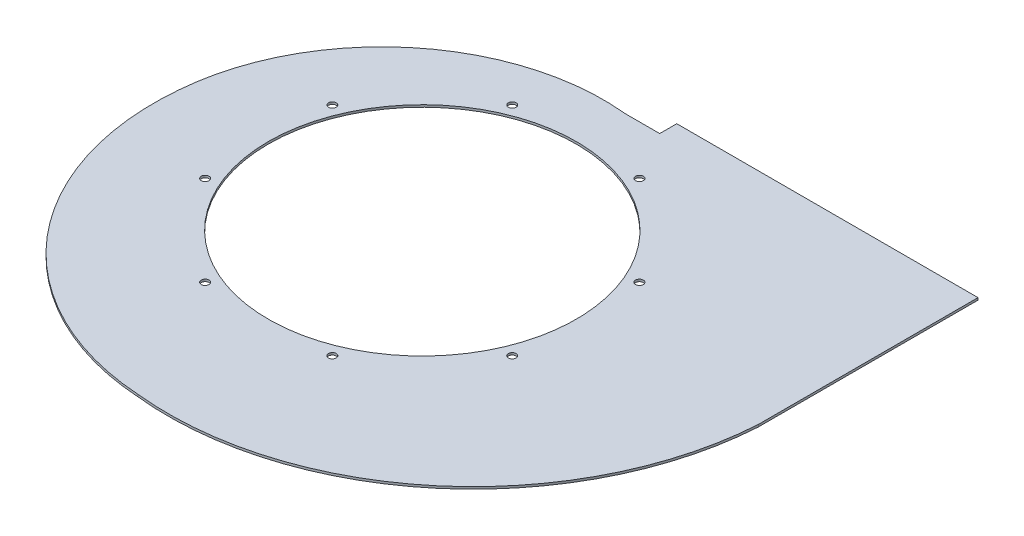
ISO-10303-21;
HEADER;
FILE_DESCRIPTION(('STEP AP214'),'2;1');
FILE_NAME('part.step','',(''),(''),'','','');
FILE_SCHEMA(('AUTOMOTIVE_DESIGN { 1 0 10303 214 1 1 1 1 }'));
ENDSEC;
DATA;
#1=APPLICATION_CONTEXT('core data for automotive mechanical design processes');
#2=APPLICATION_PROTOCOL_DEFINITION('international standard','automotive_design',2000,#1);
#3=PRODUCT_CONTEXT('',#1,'mechanical');
#4=PRODUCT('Part','Part','',(#3));
#5=PRODUCT_RELATED_PRODUCT_CATEGORY('part','',(#4));
#6=PRODUCT_DEFINITION_FORMATION('','',#4);
#7=PRODUCT_DEFINITION_CONTEXT('part definition',#1,'design');
#8=PRODUCT_DEFINITION('design','',#6,#7);
#9=PRODUCT_DEFINITION_SHAPE('','',#8);
#10=(LENGTH_UNIT() NAMED_UNIT(*) SI_UNIT(.MILLI.,.METRE.));
#11=(NAMED_UNIT(*) PLANE_ANGLE_UNIT() SI_UNIT($,.RADIAN.));
#12=(NAMED_UNIT(*) SI_UNIT($,.STERADIAN.) SOLID_ANGLE_UNIT());
#13=UNCERTAINTY_MEASURE_WITH_UNIT(LENGTH_MEASURE(1.E-05),#10,'distance_accuracy_value','');
#14=(GEOMETRIC_REPRESENTATION_CONTEXT(3) GLOBAL_UNCERTAINTY_ASSIGNED_CONTEXT((#13)) GLOBAL_UNIT_ASSIGNED_CONTEXT((#10,
#11,#12)) REPRESENTATION_CONTEXT('',''));
#15=CARTESIAN_POINT('',(0.,0.,0.));
#16=DIRECTION('',(0.,0.,1.));
#17=DIRECTION('',(1.,0.,0.));
#18=AXIS2_PLACEMENT_3D('',#15,#16,#17);
#19=CARTESIAN_POINT('',(199.99881862459,-142.996968900972,-295.996268284593));
#20=DIRECTION('',(0.,0.,-1.));
#21=DIRECTION('',(-1.,0.,0.));
#22=AXIS2_PLACEMENT_3D('',#19,#20,#21);
#23=PLANE('',#22);
#24=DIRECTION('',(-1.,0.,0.));
#25=VECTOR('',#24,1.);
#26=CARTESIAN_POINT('',(199.99881862459,-142.996968900972,-295.996268284593));
#27=LINE('',#26,#25);
#28=CARTESIAN_POINT('',(202.998818624593,-142.996968900972,-295.996268284593));
#29=VERTEX_POINT('',#28);
#30=CARTESIAN_POINT('',(-203.00118137541,-142.99696890097,-295.99626828459));
#31=VERTEX_POINT('',#30);
#32=EDGE_CURVE('E99',#29,#31,#27,.T.);
#33=ORIENTED_EDGE('',*,*,#32,.T.);
#34=DIRECTION('',(0.,-1.,0.));
#35=VECTOR('',#34,1.);
#36=CARTESIAN_POINT('',(-203.00118137541,-139.99696890097,-295.99626828459));
#37=LINE('',#36,#35);
#38=CARTESIAN_POINT('',(-203.00118137541,-139.99696890097,-295.99626828459));
#39=VERTEX_POINT('',#38);
#40=EDGE_CURVE('E158',#39,#31,#37,.T.);
#41=ORIENTED_EDGE('',*,*,#40,.F.);
#42=DIRECTION('',(-1.,0.,0.));
#43=VECTOR('',#42,1.);
#44=CARTESIAN_POINT('',(-166.225657767799,-139.99696890097,-295.996268284593));
#45=LINE('',#44,#43);
#46=CARTESIAN_POINT('',(202.998818624593,-139.996968900972,-295.996268284593));
#47=VERTEX_POINT('',#46);
#48=EDGE_CURVE('E67',#47,#39,#45,.T.);
#49=ORIENTED_EDGE('',*,*,#48,.F.);
#50=DIRECTION('',(0.,-1.,0.));
#51=VECTOR('',#50,1.);
#52=CARTESIAN_POINT('',(202.998818624593,-139.996968900972,-295.996268284593));
#53=LINE('',#52,#51);
#54=EDGE_CURVE('E141',#47,#29,#53,.T.);
#55=ORIENTED_EDGE('',*,*,#54,.T.);
#56=EDGE_LOOP('',(#33,#41,#49,#55));
#57=FACE_BOUND('',#56,.T.);
#58=ADVANCED_FACE('F48',(#57),#23,.T.);
#59=CARTESIAN_POINT('',(-250.001181375407,-142.996968900969,0.00373171541061601));
#60=DIRECTION('',(0.,1.,0.));
#61=DIRECTION('',(-1.,0.,0.));
#62=AXIS2_PLACEMENT_3D('',#59,#60,#61);
#63=CYLINDRICAL_SURFACE('',#62,207.5);
#64=CARTESIAN_POINT('',(-250.001181375407,-142.996968900969,0.00373171541061601));
#65=DIRECTION('',(0.,1.,0.));
#66=DIRECTION('',(-1.,0.,0.));
#67=AXIS2_PLACEMENT_3D('',#64,#65,#66);
#68=CIRCLE('',#67,207.5);
#69=CARTESIAN_POINT('',(-457.501181375407,-142.996968900968,0.00373171541061601));
#70=VERTEX_POINT('',#69);
#71=EDGE_CURVE('E168',#70,#70,#68,.T.);
#72=ORIENTED_EDGE('',*,*,#71,.F.);
#73=EDGE_LOOP('',(#72));
#74=FACE_BOUND('',#73,.T.);
#75=CARTESIAN_POINT('',(-250.001181375407,-139.996968900969,0.00373171541061344));
#76=DIRECTION('',(0.,1.,0.));
#77=DIRECTION('',(-1.,0.,0.));
#78=AXIS2_PLACEMENT_3D('',#75,#76,#77);
#79=CIRCLE('',#78,207.5);
#80=CARTESIAN_POINT('',(-457.501181375407,-139.996968900968,0.00373171541061344));
#81=VERTEX_POINT('',#80);
#82=EDGE_CURVE('E194',#81,#81,#79,.T.);
#83=ORIENTED_EDGE('',*,*,#82,.T.);
#84=EDGE_LOOP('',(#83));
#85=FACE_BOUND('',#84,.T.);
#86=ADVANCED_FACE('F236',(#74,#85),#63,.F.);
#87=CARTESIAN_POINT('',(-456.950196657907,-142.996968900968,85.7248205651921));
#88=DIRECTION('',(0.,1.,0.));
#89=DIRECTION('',(-1.,0.,0.));
#90=AXIS2_PLACEMENT_3D('',#87,#88,#89);
#91=CYLINDRICAL_SURFACE('',#90,5.25);
#92=CARTESIAN_POINT('',(-456.950196657907,-142.996968900968,85.7248205651921));
#93=DIRECTION('',(0.,1.,0.));
#94=DIRECTION('',(-1.,0.,0.));
#95=AXIS2_PLACEMENT_3D('',#92,#93,#94);
#96=CIRCLE('',#95,5.25);
#97=CARTESIAN_POINT('',(-462.200196657907,-142.996968900968,85.7248205651921));
#98=VERTEX_POINT('',#97);
#99=EDGE_CURVE('E173',#98,#98,#96,.T.);
#100=ORIENTED_EDGE('',*,*,#99,.F.);
#101=EDGE_LOOP('',(#100));
#102=FACE_BOUND('',#101,.T.);
#103=CARTESIAN_POINT('',(-456.950196657907,-139.996968900968,85.7248205651921));
#104=DIRECTION('',(0.,1.,0.));
#105=DIRECTION('',(-1.,0.,0.));
#106=AXIS2_PLACEMENT_3D('',#103,#104,#105);
#107=CIRCLE('',#106,5.25);
#108=CARTESIAN_POINT('',(-462.200196657907,-139.996968900968,85.7248205651921));
#109=VERTEX_POINT('',#108);
#110=EDGE_CURVE('E197',#109,#109,#107,.T.);
#111=ORIENTED_EDGE('',*,*,#110,.T.);
#112=EDGE_LOOP('',(#111));
#113=FACE_BOUND('',#112,.T.);
#114=ADVANCED_FACE('F240',(#102,#113),#91,.F.);
#115=CARTESIAN_POINT('',(-43.0521660929067,-142.99696890097,85.7248205651891));
#116=DIRECTION('',(0.,1.,0.));
#117=DIRECTION('',(-1.,0.,0.));
#118=AXIS2_PLACEMENT_3D('',#115,#116,#117);
#119=CYLINDRICAL_SURFACE('',#118,5.25);
#120=CARTESIAN_POINT('',(-43.0521660929067,-142.99696890097,85.7248205651891));
#121=DIRECTION('',(0.,1.,0.));
#122=DIRECTION('',(-1.,0.,0.));
#123=AXIS2_PLACEMENT_3D('',#120,#121,#122);
#124=CIRCLE('',#123,5.25);
#125=CARTESIAN_POINT('',(-48.3021660929067,-142.99696890097,85.7248205651891));
#126=VERTEX_POINT('',#125);
#127=EDGE_CURVE('E176',#126,#126,#124,.T.);
#128=ORIENTED_EDGE('',*,*,#127,.F.);
#129=EDGE_LOOP('',(#128));
#130=FACE_BOUND('',#129,.T.);
#131=CARTESIAN_POINT('',(-43.0521660929067,-139.99696890097,85.7248205651891));
#132=DIRECTION('',(0.,1.,0.));
#133=DIRECTION('',(-1.,0.,0.));
#134=AXIS2_PLACEMENT_3D('',#131,#132,#133);
#135=CIRCLE('',#134,5.25);
#136=CARTESIAN_POINT('',(-48.3021660929067,-139.99696890097,85.7248205651891));
#137=VERTEX_POINT('',#136);
#138=EDGE_CURVE('E200',#137,#137,#135,.T.);
#139=ORIENTED_EDGE('',*,*,#138,.T.);
#140=EDGE_LOOP('',(#139));
#141=FACE_BOUND('',#140,.T.);
#142=ADVANCED_FACE('F246',(#130,#141),#119,.F.);
#143=CARTESIAN_POINT('',(-43.052166092908,-142.996968900971,-85.7173571343709));
#144=DIRECTION('',(0.,1.,0.));
#145=DIRECTION('',(-1.,0.,0.));
#146=AXIS2_PLACEMENT_3D('',#143,#144,#145);
#147=CYLINDRICAL_SURFACE('',#146,5.25);
#148=CARTESIAN_POINT('',(-43.052166092908,-142.996968900971,-85.7173571343709));
#149=DIRECTION('',(0.,1.,0.));
#150=DIRECTION('',(-1.,0.,0.));
#151=AXIS2_PLACEMENT_3D('',#148,#149,#150);
#152=CIRCLE('',#151,5.25);
#153=CARTESIAN_POINT('',(-48.302166092908,-142.996968900971,-85.7173571343709));
#154=VERTEX_POINT('',#153);
#155=EDGE_CURVE('E179',#154,#154,#152,.T.);
#156=ORIENTED_EDGE('',*,*,#155,.F.);
#157=EDGE_LOOP('',(#156));
#158=FACE_BOUND('',#157,.T.);
#159=CARTESIAN_POINT('',(-43.052166092908,-139.996968900971,-85.7173571343709));
#160=DIRECTION('',(0.,1.,0.));
#161=DIRECTION('',(-1.,0.,0.));
#162=AXIS2_PLACEMENT_3D('',#159,#160,#161);
#163=CIRCLE('',#162,5.25);
#164=CARTESIAN_POINT('',(-48.302166092908,-139.996968900971,-85.7173571343709));
#165=VERTEX_POINT('',#164);
#166=EDGE_CURVE('E203',#165,#165,#163,.T.);
#167=ORIENTED_EDGE('',*,*,#166,.T.);
#168=EDGE_LOOP('',(#167));
#169=FACE_BOUND('',#168,.T.);
#170=ADVANCED_FACE('F250',(#158,#169),#147,.F.);
#171=CARTESIAN_POINT('',(-456.950196657908,-142.996968900968,-85.7173571343679));
#172=DIRECTION('',(0.,1.,0.));
#173=DIRECTION('',(-1.,0.,0.));
#174=AXIS2_PLACEMENT_3D('',#171,#172,#173);
#175=CYLINDRICAL_SURFACE('',#174,5.25);
#176=CARTESIAN_POINT('',(-456.950196657908,-142.996968900968,-85.7173571343679));
#177=DIRECTION('',(0.,1.,0.));
#178=DIRECTION('',(-1.,0.,0.));
#179=AXIS2_PLACEMENT_3D('',#176,#177,#178);
#180=CIRCLE('',#179,5.25);
#181=CARTESIAN_POINT('',(-462.200196657908,-142.996968900968,-85.7173571343679));
#182=VERTEX_POINT('',#181);
#183=EDGE_CURVE('E182',#182,#182,#180,.T.);
#184=ORIENTED_EDGE('',*,*,#183,.F.);
#185=EDGE_LOOP('',(#184));
#186=FACE_BOUND('',#185,.T.);
#187=CARTESIAN_POINT('',(-456.950196657908,-139.996968900968,-85.7173571343679));
#188=DIRECTION('',(0.,1.,0.));
#189=DIRECTION('',(-1.,0.,0.));
#190=AXIS2_PLACEMENT_3D('',#187,#188,#189);
#191=CIRCLE('',#190,5.25);
#192=CARTESIAN_POINT('',(-462.200196657908,-139.996968900968,-85.7173571343679));
#193=VERTEX_POINT('',#192);
#194=EDGE_CURVE('E206',#193,#193,#191,.T.);
#195=ORIENTED_EDGE('',*,*,#194,.T.);
#196=EDGE_LOOP('',(#195));
#197=FACE_BOUND('',#196,.T.);
#198=ADVANCED_FACE('F254',(#186,#197),#175,.F.);
#199=CARTESIAN_POINT('',(-335.722270225186,-142.996968900969,206.952746997911));
#200=DIRECTION('',(0.,1.,0.));
#201=DIRECTION('',(-1.,0.,0.));
#202=AXIS2_PLACEMENT_3D('',#199,#200,#201);
#203=CYLINDRICAL_SURFACE('',#202,5.24999999999999);
#204=CARTESIAN_POINT('',(-335.722270225186,-142.996968900969,206.952746997911));
#205=DIRECTION('',(0.,1.,0.));
#206=DIRECTION('',(-1.,0.,0.));
#207=AXIS2_PLACEMENT_3D('',#204,#205,#206);
#208=CIRCLE('',#207,5.24999999999999);
#209=CARTESIAN_POINT('',(-340.972270225186,-142.996968900969,206.952746997911));
#210=VERTEX_POINT('',#209);
#211=EDGE_CURVE('E185',#210,#210,#208,.T.);
#212=ORIENTED_EDGE('',*,*,#211,.F.);
#213=EDGE_LOOP('',(#212));
#214=FACE_BOUND('',#213,.T.);
#215=CARTESIAN_POINT('',(-335.722270225186,-139.996968900969,206.952746997911));
#216=DIRECTION('',(0.,1.,0.));
#217=DIRECTION('',(-1.,0.,0.));
#218=AXIS2_PLACEMENT_3D('',#215,#216,#217);
#219=CIRCLE('',#218,5.24999999999999);
#220=CARTESIAN_POINT('',(-340.972270225186,-139.996968900969,206.952746997911));
#221=VERTEX_POINT('',#220);
#222=EDGE_CURVE('E209',#221,#221,#219,.T.);
#223=ORIENTED_EDGE('',*,*,#222,.T.);
#224=EDGE_LOOP('',(#223));
#225=FACE_BOUND('',#224,.T.);
#226=ADVANCED_FACE('F258',(#214,#225),#203,.F.);
#227=CARTESIAN_POINT('',(-164.280092525626,-142.99696890097,206.95274699791));
#228=DIRECTION('',(0.,1.,0.));
#229=DIRECTION('',(-1.,0.,0.));
#230=AXIS2_PLACEMENT_3D('',#227,#228,#229);
#231=CYLINDRICAL_SURFACE('',#230,5.24999999999999);
#232=CARTESIAN_POINT('',(-164.280092525626,-142.99696890097,206.95274699791));
#233=DIRECTION('',(0.,1.,0.));
#234=DIRECTION('',(-1.,0.,0.));
#235=AXIS2_PLACEMENT_3D('',#232,#233,#234);
#236=CIRCLE('',#235,5.24999999999999);
#237=CARTESIAN_POINT('',(-169.530092525626,-142.99696890097,206.95274699791));
#238=VERTEX_POINT('',#237);
#239=EDGE_CURVE('E188',#238,#238,#236,.T.);
#240=ORIENTED_EDGE('',*,*,#239,.F.);
#241=EDGE_LOOP('',(#240));
#242=FACE_BOUND('',#241,.T.);
#243=CARTESIAN_POINT('',(-164.280092525626,-139.99696890097,206.95274699791));
#244=DIRECTION('',(0.,1.,0.));
#245=DIRECTION('',(-1.,0.,0.));
#246=AXIS2_PLACEMENT_3D('',#243,#244,#245);
#247=CIRCLE('',#246,5.24999999999999);
#248=CARTESIAN_POINT('',(-169.530092525626,-139.99696890097,206.95274699791));
#249=VERTEX_POINT('',#248);
#250=EDGE_CURVE('E212',#249,#249,#247,.T.);
#251=ORIENTED_EDGE('',*,*,#250,.T.);
#252=EDGE_LOOP('',(#251));
#253=FACE_BOUND('',#252,.T.);
#254=ADVANCED_FACE('F262',(#242,#253),#231,.F.);
#255=CARTESIAN_POINT('',(-164.280092525629,-142.99696890097,-206.94528356709));
#256=DIRECTION('',(0.,1.,0.));
#257=DIRECTION('',(-1.,0.,0.));
#258=AXIS2_PLACEMENT_3D('',#255,#256,#257);
#259=CYLINDRICAL_SURFACE('',#258,5.24999999999999);
#260=CARTESIAN_POINT('',(-164.280092525629,-142.99696890097,-206.94528356709));
#261=DIRECTION('',(0.,1.,0.));
#262=DIRECTION('',(-1.,0.,0.));
#263=AXIS2_PLACEMENT_3D('',#260,#261,#262);
#264=CIRCLE('',#263,5.24999999999999);
#265=CARTESIAN_POINT('',(-169.530092525629,-142.99696890097,-206.94528356709));
#266=VERTEX_POINT('',#265);
#267=EDGE_CURVE('E58',#266,#266,#264,.T.);
#268=ORIENTED_EDGE('',*,*,#267,.F.);
#269=EDGE_LOOP('',(#268));
#270=FACE_BOUND('',#269,.T.);
#271=CARTESIAN_POINT('',(-164.280092525629,-139.99696890097,-206.94528356709));
#272=DIRECTION('',(0.,1.,0.));
#273=DIRECTION('',(-1.,0.,0.));
#274=AXIS2_PLACEMENT_3D('',#271,#272,#273);
#275=CIRCLE('',#274,5.24999999999999);
#276=CARTESIAN_POINT('',(-169.530092525629,-139.99696890097,-206.94528356709));
#277=VERTEX_POINT('',#276);
#278=EDGE_CURVE('E214',#277,#277,#275,.T.);
#279=ORIENTED_EDGE('',*,*,#278,.T.);
#280=EDGE_LOOP('',(#279));
#281=FACE_BOUND('',#280,.T.);
#282=ADVANCED_FACE('F265',(#270,#281),#259,.F.);
#283=CARTESIAN_POINT('',(-335.722270225189,-142.996968900969,-206.945283567089));
#284=DIRECTION('',(0.,1.,0.));
#285=DIRECTION('',(-1.,0.,0.));
#286=AXIS2_PLACEMENT_3D('',#283,#284,#285);
#287=CYLINDRICAL_SURFACE('',#286,5.24999999999999);
#288=CARTESIAN_POINT('',(-335.722270225189,-142.996968900969,-206.945283567089));
#289=DIRECTION('',(0.,1.,0.));
#290=DIRECTION('',(-1.,0.,0.));
#291=AXIS2_PLACEMENT_3D('',#288,#289,#290);
#292=CIRCLE('',#291,5.24999999999999);
#293=CARTESIAN_POINT('',(-340.972270225189,-142.996968900969,-206.945283567089));
#294=VERTEX_POINT('',#293);
#295=EDGE_CURVE('E13',#294,#294,#292,.T.);
#296=ORIENTED_EDGE('',*,*,#295,.F.);
#297=EDGE_LOOP('',(#296));
#298=FACE_BOUND('',#297,.T.);
#299=CARTESIAN_POINT('',(-335.722270225189,-139.996968900969,-206.945283567089));
#300=DIRECTION('',(0.,1.,0.));
#301=DIRECTION('',(-1.,0.,0.));
#302=AXIS2_PLACEMENT_3D('',#299,#300,#301);
#303=CIRCLE('',#302,5.24999999999999);
#304=CARTESIAN_POINT('',(-340.972270225189,-139.996968900969,-206.945283567089));
#305=VERTEX_POINT('',#304);
#306=EDGE_CURVE('E52',#305,#305,#303,.T.);
#307=ORIENTED_EDGE('',*,*,#306,.T.);
#308=EDGE_LOOP('',(#307));
#309=FACE_BOUND('',#308,.T.);
#310=ADVANCED_FACE('F50',(#298,#309),#287,.F.);
#311=CARTESIAN_POINT('',(-166.225657767799,-142.99696890097,10.3857050223773));
#312=DIRECTION('',(0.,1.,0.));
#313=DIRECTION('',(-1.,0.,0.));
#314=AXIS2_PLACEMENT_3D('',#311,#312,#313);
#315=PLANE('',#314);
#316=ORIENTED_EDGE('',*,*,#32,.F.);
#317=DIRECTION('',(0.,0.,1.));
#318=VECTOR('',#317,1.);
#319=CARTESIAN_POINT('',(202.998818624593,-142.996968900972,0.0981735703448938));
#320=LINE('',#319,#318);
#321=CARTESIAN_POINT('',(202.998818624593,-142.996968900972,0.0981735703448938));
#322=VERTEX_POINT('',#321);
#323=EDGE_CURVE('E142',#29,#322,#320,.T.);
#324=ORIENTED_EDGE('',*,*,#323,.T.);
#325=CARTESIAN_POINT('',(-207.154194239235,-142.99696890097,-25.7037835180613));
#326=DIRECTION('',(0.,-1.,0.));
#327=DIRECTION('',(1.,0.,0.));
#328=AXIS2_PLACEMENT_3D('',#325,#326,#327);
#329=CIRCLE('',#328,410.963787882664);
#330=CARTESIAN_POINT('',(-250.253938148518,-142.996968900969,382.993717117582));
#331=VERTEX_POINT('',#330);
#332=EDGE_CURVE('E145',#322,#331,#329,.T.);
#333=ORIENTED_EDGE('',*,*,#332,.T.);
#334=CARTESIAN_POINT('',(-227.904024977349,-142.99696890097,32.1245847960234));
#335=DIRECTION('',(0.,-1.,0.));
#336=DIRECTION('',(1.,0.,0.));
#337=AXIS2_PLACEMENT_3D('',#334,#335,#336);
#338=CIRCLE('',#337,351.580242099641);
#339=CARTESIAN_POINT('',(-577.989841923088,-142.996968900968,-0.257314596645165));
#340=VERTEX_POINT('',#339);
#341=EDGE_CURVE('E148',#331,#340,#338,.T.);
#342=ORIENTED_EDGE('',*,*,#341,.T.);
#343=CARTESIAN_POINT('',(-280.229739567359,-142.996968900969,24.219356113987));
#344=DIRECTION('',(0.,-1.,0.));
#345=DIRECTION('',(1.,0.,0.));
#346=AXIS2_PLACEMENT_3D('',#343,#344,#345);
#347=CIRCLE('',#346,298.764432227082);
#348=CARTESIAN_POINT('',(-249.847860472498,-142.99696890097,-272.99626828459));
#349=VERTEX_POINT('',#348);
#350=EDGE_CURVE('E151',#340,#349,#347,.T.);
#351=ORIENTED_EDGE('',*,*,#350,.T.);
#352=DIRECTION('',(1.,0.,0.));
#353=VECTOR('',#352,1.);
#354=CARTESIAN_POINT('',(-203.00118137541,-142.99696890097,-272.99626828459));
#355=LINE('',#354,#353);
#356=CARTESIAN_POINT('',(-203.00118137541,-142.99696890097,-272.99626828459));
#357=VERTEX_POINT('',#356);
#358=EDGE_CURVE('E117',#349,#357,#355,.T.);
#359=ORIENTED_EDGE('',*,*,#358,.T.);
#360=DIRECTION('',(0.,0.,-1.));
#361=VECTOR('',#360,1.);
#362=CARTESIAN_POINT('',(-203.00118137541,-142.99696890097,-295.99626828459));
#363=LINE('',#362,#361);
#364=EDGE_CURVE('E154',#357,#31,#363,.T.);
#365=ORIENTED_EDGE('',*,*,#364,.T.);
#366=EDGE_LOOP('',(#316,#324,#333,#342,#351,#359,#365));
#367=FACE_BOUND('',#366,.T.);
#368=ORIENTED_EDGE('',*,*,#71,.T.);
#369=EDGE_LOOP('',(#368));
#370=FACE_BOUND('',#369,.T.);
#371=ORIENTED_EDGE('',*,*,#99,.T.);
#372=EDGE_LOOP('',(#371));
#373=FACE_BOUND('',#372,.T.);
#374=ORIENTED_EDGE('',*,*,#127,.T.);
#375=EDGE_LOOP('',(#374));
#376=FACE_BOUND('',#375,.T.);
#377=ORIENTED_EDGE('',*,*,#155,.T.);
#378=EDGE_LOOP('',(#377));
#379=FACE_BOUND('',#378,.T.);
#380=ORIENTED_EDGE('',*,*,#183,.T.);
#381=EDGE_LOOP('',(#380));
#382=FACE_BOUND('',#381,.T.);
#383=ORIENTED_EDGE('',*,*,#211,.T.);
#384=EDGE_LOOP('',(#383));
#385=FACE_BOUND('',#384,.T.);
#386=ORIENTED_EDGE('',*,*,#239,.T.);
#387=EDGE_LOOP('',(#386));
#388=FACE_BOUND('',#387,.T.);
#389=ORIENTED_EDGE('',*,*,#267,.T.);
#390=EDGE_LOOP('',(#389));
#391=FACE_BOUND('',#390,.T.);
#392=ORIENTED_EDGE('',*,*,#295,.T.);
#393=EDGE_LOOP('',(#392));
#394=FACE_BOUND('',#393,.T.);
#395=ADVANCED_FACE('F224',(#367,#370,#373,#376,#379,#382,#385,#388,#391,#394),#315,.F.);
#396=CARTESIAN_POINT('',(-166.225657767799,-139.99696890097,10.3857050223773));
#397=DIRECTION('',(0.,1.,0.));
#398=DIRECTION('',(-1.,0.,0.));
#399=AXIS2_PLACEMENT_3D('',#396,#397,#398);
#400=PLANE('',#399);
#401=DIRECTION('',(0.,0.,1.));
#402=VECTOR('',#401,1.);
#403=CARTESIAN_POINT('',(202.998818624593,-139.996968900972,0.0981735703448912));
#404=LINE('',#403,#402);
#405=CARTESIAN_POINT('',(202.998818624593,-139.996968900972,0.0981735703448912));
#406=VERTEX_POINT('',#405);
#407=EDGE_CURVE('E157',#47,#406,#404,.T.);
#408=ORIENTED_EDGE('',*,*,#407,.F.);
#409=ORIENTED_EDGE('',*,*,#48,.T.);
#410=DIRECTION('',(0.,0.,-1.));
#411=VECTOR('',#410,1.);
#412=CARTESIAN_POINT('',(-203.00118137541,-139.99696890097,-295.99626828459));
#413=LINE('',#412,#411);
#414=CARTESIAN_POINT('',(-203.00118137541,-139.99696890097,-272.99626828459));
#415=VERTEX_POINT('',#414);
#416=EDGE_CURVE('E131',#415,#39,#413,.T.);
#417=ORIENTED_EDGE('',*,*,#416,.F.);
#418=DIRECTION('',(1.,0.,0.));
#419=VECTOR('',#418,1.);
#420=CARTESIAN_POINT('',(-203.00118137541,-139.99696890097,-272.99626828459));
#421=LINE('',#420,#419);
#422=CARTESIAN_POINT('',(-249.847860472498,-139.99696890097,-272.99626828459));
#423=VERTEX_POINT('',#422);
#424=EDGE_CURVE('E116',#423,#415,#421,.T.);
#425=ORIENTED_EDGE('',*,*,#424,.F.);
#426=CARTESIAN_POINT('',(-280.229739567359,-139.996968900969,24.219356113987));
#427=DIRECTION('',(0.,-1.,0.));
#428=DIRECTION('',(1.,0.,0.));
#429=AXIS2_PLACEMENT_3D('',#426,#427,#428);
#430=CIRCLE('',#429,298.764432227082);
#431=CARTESIAN_POINT('',(-577.989841923088,-139.996968900968,-0.257314596645168));
#432=VERTEX_POINT('',#431);
#433=EDGE_CURVE('E128',#432,#423,#430,.T.);
#434=ORIENTED_EDGE('',*,*,#433,.F.);
#435=CARTESIAN_POINT('',(-227.904024977349,-139.99696890097,32.1245847960234));
#436=DIRECTION('',(0.,-1.,0.));
#437=DIRECTION('',(1.,0.,0.));
#438=AXIS2_PLACEMENT_3D('',#435,#436,#437);
#439=CIRCLE('',#438,351.580242099641);
#440=CARTESIAN_POINT('',(-250.253938148518,-139.996968900969,382.993717117582));
#441=VERTEX_POINT('',#440);
#442=EDGE_CURVE('E134',#441,#432,#439,.T.);
#443=ORIENTED_EDGE('',*,*,#442,.F.);
#444=CARTESIAN_POINT('',(-207.154194239235,-139.99696890097,-25.7037835180613));
#445=DIRECTION('',(0.,-1.,0.));
#446=DIRECTION('',(1.,0.,0.));
#447=AXIS2_PLACEMENT_3D('',#444,#445,#446);
#448=CIRCLE('',#447,410.963787882664);
#449=EDGE_CURVE('E136',#406,#441,#448,.T.);
#450=ORIENTED_EDGE('',*,*,#449,.F.);
#451=EDGE_LOOP('',(#408,#409,#417,#425,#434,#443,#450));
#452=FACE_BOUND('',#451,.T.);
#453=ORIENTED_EDGE('',*,*,#82,.F.);
#454=EDGE_LOOP('',(#453));
#455=FACE_BOUND('',#454,.T.);
#456=ORIENTED_EDGE('',*,*,#110,.F.);
#457=EDGE_LOOP('',(#456));
#458=FACE_BOUND('',#457,.T.);
#459=ORIENTED_EDGE('',*,*,#138,.F.);
#460=EDGE_LOOP('',(#459));
#461=FACE_BOUND('',#460,.T.);
#462=ORIENTED_EDGE('',*,*,#166,.F.);
#463=EDGE_LOOP('',(#462));
#464=FACE_BOUND('',#463,.T.);
#465=ORIENTED_EDGE('',*,*,#194,.F.);
#466=EDGE_LOOP('',(#465));
#467=FACE_BOUND('',#466,.T.);
#468=ORIENTED_EDGE('',*,*,#222,.F.);
#469=EDGE_LOOP('',(#468));
#470=FACE_BOUND('',#469,.T.);
#471=ORIENTED_EDGE('',*,*,#250,.F.);
#472=EDGE_LOOP('',(#471));
#473=FACE_BOUND('',#472,.T.);
#474=ORIENTED_EDGE('',*,*,#278,.F.);
#475=EDGE_LOOP('',(#474));
#476=FACE_BOUND('',#475,.T.);
#477=ORIENTED_EDGE('',*,*,#306,.F.);
#478=EDGE_LOOP('',(#477));
#479=FACE_BOUND('',#478,.T.);
#480=ADVANCED_FACE('F125',(#452,#455,#458,#461,#464,#467,#470,#473,#476,#479),#400,.T.);
#481=CARTESIAN_POINT('',(-203.00118137541,-139.99696890097,-295.99626828459));
#482=DIRECTION('',(-1.,0.,0.));
#483=DIRECTION('',(0.,-1.,0.));
#484=AXIS2_PLACEMENT_3D('',#481,#482,#483);
#485=PLANE('',#484);
#486=ORIENTED_EDGE('',*,*,#364,.F.);
#487=DIRECTION('',(0.,-1.,0.));
#488=VECTOR('',#487,1.);
#489=CARTESIAN_POINT('',(-203.00118137541,-139.99696890097,-272.99626828459));
#490=LINE('',#489,#488);
#491=EDGE_CURVE('E93',#415,#357,#490,.T.);
#492=ORIENTED_EDGE('',*,*,#491,.F.);
#493=ORIENTED_EDGE('',*,*,#416,.T.);
#494=ORIENTED_EDGE('',*,*,#40,.T.);
#495=EDGE_LOOP('',(#486,#492,#493,#494));
#496=FACE_BOUND('',#495,.T.);
#497=ADVANCED_FACE('F223',(#496),#485,.T.);
#498=CARTESIAN_POINT('',(-203.00118137541,-139.99696890097,-272.99626828459));
#499=DIRECTION('',(0.,0.,-1.));
#500=DIRECTION('',(0.,1.,0.));
#501=AXIS2_PLACEMENT_3D('',#498,#499,#500);
#502=PLANE('',#501);
#503=ORIENTED_EDGE('',*,*,#358,.F.);
#504=DIRECTION('',(0.,-1.,0.));
#505=VECTOR('',#504,1.);
#506=CARTESIAN_POINT('',(-249.847860472498,-139.99696890097,-272.99626828459));
#507=LINE('',#506,#505);
#508=EDGE_CURVE('E113',#423,#349,#507,.T.);
#509=ORIENTED_EDGE('',*,*,#508,.F.);
#510=ORIENTED_EDGE('',*,*,#424,.T.);
#511=ORIENTED_EDGE('',*,*,#491,.T.);
#512=EDGE_LOOP('',(#503,#509,#510,#511));
#513=FACE_BOUND('',#512,.T.);
#514=ADVANCED_FACE('F115',(#513),#502,.T.);
#515=CARTESIAN_POINT('',(-280.229739567359,-139.996968900969,24.219356113987));
#516=DIRECTION('',(0.,-1.,0.));
#517=DIRECTION('',(1.,0.,0.));
#518=AXIS2_PLACEMENT_3D('',#515,#516,#517);
#519=CYLINDRICAL_SURFACE('',#518,298.764432227082);
#520=ORIENTED_EDGE('',*,*,#350,.F.);
#521=DIRECTION('',(0.,-1.,0.));
#522=VECTOR('',#521,1.);
#523=CARTESIAN_POINT('',(-577.989841923088,-139.996968900968,-0.257314596645168));
#524=LINE('',#523,#522);
#525=EDGE_CURVE('E122',#432,#340,#524,.T.);
#526=ORIENTED_EDGE('',*,*,#525,.F.);
#527=ORIENTED_EDGE('',*,*,#433,.T.);
#528=ORIENTED_EDGE('',*,*,#508,.T.);
#529=EDGE_LOOP('',(#520,#526,#527,#528));
#530=FACE_BOUND('',#529,.T.);
#531=ADVANCED_FACE('F133',(#530),#519,.T.);
#532=CARTESIAN_POINT('',(-227.904024977349,-139.99696890097,32.1245847960234));
#533=DIRECTION('',(0.,-1.,0.));
#534=DIRECTION('',(1.,0.,0.));
#535=AXIS2_PLACEMENT_3D('',#532,#533,#534);
#536=CYLINDRICAL_SURFACE('',#535,351.580242099641);
#537=ORIENTED_EDGE('',*,*,#341,.F.);
#538=DIRECTION('',(0.,-1.,0.));
#539=VECTOR('',#538,1.);
#540=CARTESIAN_POINT('',(-250.253938148518,-139.996968900969,382.993717117582));
#541=LINE('',#540,#539);
#542=EDGE_CURVE('E162',#441,#331,#541,.T.);
#543=ORIENTED_EDGE('',*,*,#542,.F.);
#544=ORIENTED_EDGE('',*,*,#442,.T.);
#545=ORIENTED_EDGE('',*,*,#525,.T.);
#546=EDGE_LOOP('',(#537,#543,#544,#545));
#547=FACE_BOUND('',#546,.T.);
#548=ADVANCED_FACE('F316',(#547),#536,.T.);
#549=CARTESIAN_POINT('',(-207.154194239235,-139.99696890097,-25.7037835180613));
#550=DIRECTION('',(0.,-1.,0.));
#551=DIRECTION('',(1.,0.,0.));
#552=AXIS2_PLACEMENT_3D('',#549,#550,#551);
#553=CYLINDRICAL_SURFACE('',#552,410.963787882664);
#554=ORIENTED_EDGE('',*,*,#332,.F.);
#555=DIRECTION('',(0.,-1.,0.));
#556=VECTOR('',#555,1.);
#557=CARTESIAN_POINT('',(202.998818624593,-139.996968900972,0.0981735703448912));
#558=LINE('',#557,#556);
#559=EDGE_CURVE('E164',#406,#322,#558,.T.);
#560=ORIENTED_EDGE('',*,*,#559,.F.);
#561=ORIENTED_EDGE('',*,*,#449,.T.);
#562=ORIENTED_EDGE('',*,*,#542,.T.);
#563=EDGE_LOOP('',(#554,#560,#561,#562));
#564=FACE_BOUND('',#563,.T.);
#565=ADVANCED_FACE('F326',(#564),#553,.T.);
#566=CARTESIAN_POINT('',(202.998818624593,-139.996968900972,0.0981735703448912));
#567=DIRECTION('',(1.,0.,0.));
#568=DIRECTION('',(0.,1.,0.));
#569=AXIS2_PLACEMENT_3D('',#566,#567,#568);
#570=PLANE('',#569);
#571=ORIENTED_EDGE('',*,*,#323,.F.);
#572=ORIENTED_EDGE('',*,*,#54,.F.);
#573=ORIENTED_EDGE('',*,*,#407,.T.);
#574=ORIENTED_EDGE('',*,*,#559,.T.);
#575=EDGE_LOOP('',(#571,#572,#573,#574));
#576=FACE_BOUND('',#575,.T.);
#577=ADVANCED_FACE('F337',(#576),#570,.T.);
#578=CLOSED_SHELL('',(#58,#86,#114,#142,#170,#198,#226,#254,#282,#310,#395,#480,#497,#514,#531,
#548,#565,#577));
#579=MANIFOLD_SOLID_BREP('B2',#578);
#580=ADVANCED_BREP_SHAPE_REPRESENTATION('',(#18,#579),#14);
#581=SHAPE_DEFINITION_REPRESENTATION(#9,#580);
ENDSEC;
END-ISO-10303-21;
